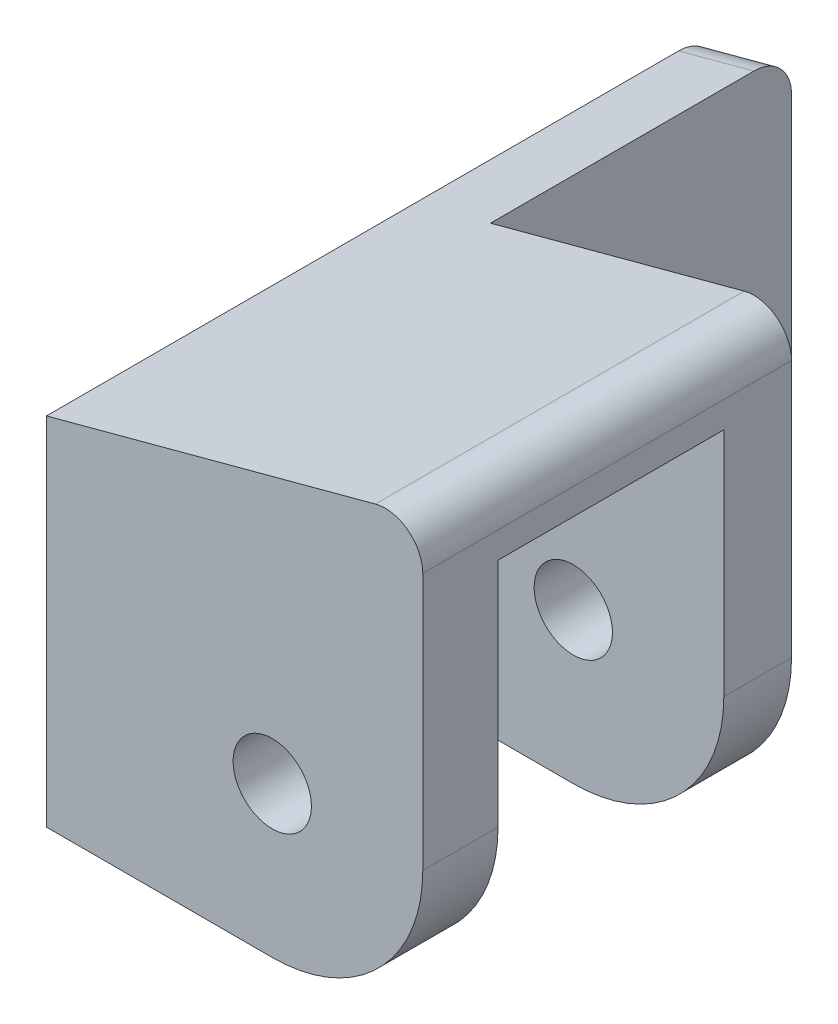
ISO-10303-21;
HEADER;
FILE_DESCRIPTION(('STEP AP214'),'2;1');
FILE_NAME('part.step','',(''),(''),'','','');
FILE_SCHEMA(('AUTOMOTIVE_DESIGN { 1 0 10303 214 1 1 1 1 }'));
ENDSEC;
DATA;
#1=APPLICATION_CONTEXT('core data for automotive mechanical design processes');
#2=APPLICATION_PROTOCOL_DEFINITION('international standard','automotive_design',2000,#1);
#3=PRODUCT_CONTEXT('',#1,'mechanical');
#4=PRODUCT('Part','Part','',(#3));
#5=PRODUCT_RELATED_PRODUCT_CATEGORY('part','',(#4));
#6=PRODUCT_DEFINITION_FORMATION('','',#4);
#7=PRODUCT_DEFINITION_CONTEXT('part definition',#1,'design');
#8=PRODUCT_DEFINITION('design','',#6,#7);
#9=PRODUCT_DEFINITION_SHAPE('','',#8);
#10=(LENGTH_UNIT() NAMED_UNIT(*) SI_UNIT(.MILLI.,.METRE.));
#11=(NAMED_UNIT(*) PLANE_ANGLE_UNIT() SI_UNIT($,.RADIAN.));
#12=(NAMED_UNIT(*) SI_UNIT($,.STERADIAN.) SOLID_ANGLE_UNIT());
#13=UNCERTAINTY_MEASURE_WITH_UNIT(LENGTH_MEASURE(1.E-05),#10,'distance_accuracy_value','');
#14=(GEOMETRIC_REPRESENTATION_CONTEXT(3) GLOBAL_UNCERTAINTY_ASSIGNED_CONTEXT((#13)) GLOBAL_UNIT_ASSIGNED_CONTEXT((#10,
#11,#12)) REPRESENTATION_CONTEXT('',''));
#15=CARTESIAN_POINT('',(0.,0.,0.));
#16=DIRECTION('',(0.,0.,1.));
#17=DIRECTION('',(1.,0.,0.));
#18=AXIS2_PLACEMENT_3D('',#15,#16,#17);
#19=CARTESIAN_POINT('',(10.,-10.,4.5));
#20=DIRECTION('',(-1.,0.,0.));
#21=DIRECTION('',(0.,1.,0.));
#22=AXIS2_PLACEMENT_3D('',#19,#20,#21);
#23=PLANE('',#22);
#24=DIRECTION('',(0.,-1.,0.));
#25=VECTOR('',#24,1.);
#26=CARTESIAN_POINT('',(10.,-10.,0.));
#27=LINE('',#26,#25);
#28=CARTESIAN_POINT('',(10.,17.1009204165195,0.));
#29=VERTEX_POINT('',#28);
#30=CARTESIAN_POINT('',(10.,0.,0.));
#31=VERTEX_POINT('',#30);
#32=EDGE_CURVE('E239',#29,#31,#27,.T.);
#33=ORIENTED_EDGE('',*,*,#32,.F.);
#34=DIRECTION('',(0.,0.,-1.));
#35=VECTOR('',#34,1.);
#36=CARTESIAN_POINT('',(10.,17.1009204165195,0.));
#37=LINE('',#36,#35);
#38=CARTESIAN_POINT('',(10.,17.1009204165195,24.5));
#39=VERTEX_POINT('',#38);
#40=EDGE_CURVE('E256',#39,#29,#37,.T.);
#41=ORIENTED_EDGE('',*,*,#40,.F.);
#42=DIRECTION('',(0.,-1.,0.));
#43=VECTOR('',#42,1.);
#44=CARTESIAN_POINT('',(10.,20.3589838486225,24.5));
#45=LINE('',#44,#43);
#46=CARTESIAN_POINT('',(10.,0.,24.5));
#47=VERTEX_POINT('',#46);
#48=EDGE_CURVE('E160',#39,#47,#45,.T.);
#49=ORIENTED_EDGE('',*,*,#48,.T.);
#50=DIRECTION('',(0.,0.,-1.));
#51=VECTOR('',#50,1.);
#52=CARTESIAN_POINT('',(10.,0.,4.5));
#53=LINE('',#52,#51);
#54=CARTESIAN_POINT('',(10.,0.,19.5));
#55=VERTEX_POINT('',#54);
#56=EDGE_CURVE('E322',#55,#47,#53,.F.);
#57=ORIENTED_EDGE('',*,*,#56,.F.);
#58=DIRECTION('',(0.,-1.,0.));
#59=VECTOR('',#58,1.);
#60=CARTESIAN_POINT('',(10.,20.3589838486225,19.5));
#61=LINE('',#60,#59);
#62=CARTESIAN_POINT('',(10.,15.3589838486225,19.5));
#63=VERTEX_POINT('',#62);
#64=EDGE_CURVE('E185',#63,#55,#61,.T.);
#65=ORIENTED_EDGE('',*,*,#64,.F.);
#66=DIRECTION('',(0.,0.,-1.));
#67=VECTOR('',#66,1.);
#68=CARTESIAN_POINT('',(10.,15.3589838486225,73.8276988943025));
#69=LINE('',#68,#67);
#70=CARTESIAN_POINT('',(10.,15.3589838486225,4.5));
#71=VERTEX_POINT('',#70);
#72=EDGE_CURVE('E174',#63,#71,#69,.T.);
#73=ORIENTED_EDGE('',*,*,#72,.T.);
#74=DIRECTION('',(0.,-1.,0.));
#75=VECTOR('',#74,1.);
#76=CARTESIAN_POINT('',(10.,-10.,4.5));
#77=LINE('',#76,#75);
#78=CARTESIAN_POINT('',(10.,0.,4.5));
#79=VERTEX_POINT('',#78);
#80=EDGE_CURVE('E240',#71,#79,#77,.T.);
#81=ORIENTED_EDGE('',*,*,#80,.T.);
#82=DIRECTION('',(0.,0.,-1.));
#83=VECTOR('',#82,1.);
#84=CARTESIAN_POINT('',(10.,0.,4.5));
#85=LINE('',#84,#83);
#86=EDGE_CURVE('E325',#31,#79,#85,.F.);
#87=ORIENTED_EDGE('',*,*,#86,.F.);
#88=EDGE_LOOP('',(#33,#41,#49,#57,#65,#73,#81,#87));
#89=FACE_BOUND('',#88,.T.);
#90=ADVANCED_FACE('F41',(#89),#23,.F.);
#91=CARTESIAN_POINT('',(10.,-10.,4.5));
#92=DIRECTION('',(0.,1.,0.));
#93=DIRECTION('',(1.,0.,0.));
#94=AXIS2_PLACEMENT_3D('',#91,#92,#93);
#95=PLANE('',#94);
#96=DIRECTION('',(-1.,0.,0.));
#97=VECTOR('',#96,1.);
#98=CARTESIAN_POINT('',(10.,-10.,4.5));
#99=LINE('',#98,#97);
#100=CARTESIAN_POINT('',(0.,-10.,4.5));
#101=VERTEX_POINT('',#100);
#102=CARTESIAN_POINT('',(-10.,-10.,4.5));
#103=VERTEX_POINT('',#102);
#104=EDGE_CURVE('E244',#101,#103,#99,.T.);
#105=ORIENTED_EDGE('',*,*,#104,.T.);
#106=DIRECTION('',(0.,0.,-1.));
#107=VECTOR('',#106,1.);
#108=CARTESIAN_POINT('',(-10.,-10.,73.8276988943025));
#109=LINE('',#108,#107);
#110=CARTESIAN_POINT('',(-10.,-10.,19.5));
#111=VERTEX_POINT('',#110);
#112=EDGE_CURVE('E225',#111,#103,#109,.T.);
#113=ORIENTED_EDGE('',*,*,#112,.F.);
#114=DIRECTION('',(-1.,0.,0.));
#115=VECTOR('',#114,1.);
#116=CARTESIAN_POINT('',(-15.,-10.,19.5));
#117=LINE('',#116,#115);
#118=CARTESIAN_POINT('',(0.,-10.,19.5));
#119=VERTEX_POINT('',#118);
#120=EDGE_CURVE('E181',#119,#111,#117,.T.);
#121=ORIENTED_EDGE('',*,*,#120,.F.);
#122=DIRECTION('',(0.,0.,-1.));
#123=VECTOR('',#122,1.);
#124=CARTESIAN_POINT('',(0.,-10.,4.5));
#125=LINE('',#124,#123);
#126=CARTESIAN_POINT('',(0.,-10.,24.5));
#127=VERTEX_POINT('',#126);
#128=EDGE_CURVE('E312',#127,#119,#125,.T.);
#129=ORIENTED_EDGE('',*,*,#128,.F.);
#130=DIRECTION('',(-1.,0.,0.));
#131=VECTOR('',#130,1.);
#132=CARTESIAN_POINT('',(-15.,-10.,24.5));
#133=LINE('',#132,#131);
#134=CARTESIAN_POINT('',(-15.,-10.,24.5));
#135=VERTEX_POINT('',#134);
#136=EDGE_CURVE('E194',#127,#135,#133,.T.);
#137=ORIENTED_EDGE('',*,*,#136,.T.);
#138=DIRECTION('',(0.,0.,-1.));
#139=VECTOR('',#138,1.);
#140=CARTESIAN_POINT('',(-15.,-10.,73.8276988943025));
#141=LINE('',#140,#139);
#142=CARTESIAN_POINT('',(-15.,-10.,-17.5));
#143=VERTEX_POINT('',#142);
#144=EDGE_CURVE('E173',#135,#143,#141,.T.);
#145=ORIENTED_EDGE('',*,*,#144,.T.);
#146=DIRECTION('',(1.,0.,0.));
#147=VECTOR('',#146,1.);
#148=CARTESIAN_POINT('',(10.,-10.,-17.5));
#149=LINE('',#148,#147);
#150=CARTESIAN_POINT('',(-10.,-10.,-17.5));
#151=VERTEX_POINT('',#150);
#152=EDGE_CURVE('E308',#151,#143,#149,.F.);
#153=ORIENTED_EDGE('',*,*,#152,.F.);
#154=DIRECTION('',(0.,0.,1.));
#155=VECTOR('',#154,1.);
#156=CARTESIAN_POINT('',(-10.,-10.,-20.));
#157=LINE('',#156,#155);
#158=CARTESIAN_POINT('',(-10.,-10.,0.));
#159=VERTEX_POINT('',#158);
#160=EDGE_CURVE('E213',#151,#159,#157,.T.);
#161=ORIENTED_EDGE('',*,*,#160,.T.);
#162=DIRECTION('',(-1.,0.,0.));
#163=VECTOR('',#162,1.);
#164=CARTESIAN_POINT('',(10.,-10.,0.));
#165=LINE('',#164,#163);
#166=CARTESIAN_POINT('',(0.,-10.,0.));
#167=VERTEX_POINT('',#166);
#168=EDGE_CURVE('E245',#167,#159,#165,.T.);
#169=ORIENTED_EDGE('',*,*,#168,.F.);
#170=DIRECTION('',(0.,0.,-1.));
#171=VECTOR('',#170,1.);
#172=CARTESIAN_POINT('',(0.,-10.,4.5));
#173=LINE('',#172,#171);
#174=EDGE_CURVE('E315',#101,#167,#173,.T.);
#175=ORIENTED_EDGE('',*,*,#174,.F.);
#176=EDGE_LOOP('',(#105,#113,#121,#129,#137,#145,#153,#161,#169,#175));
#177=FACE_BOUND('',#176,.T.);
#178=ADVANCED_FACE('F336',(#177),#95,.F.);
#179=CARTESIAN_POINT('',(0.,0.,4.5));
#180=DIRECTION('',(0.,0.,-1.));
#181=DIRECTION('',(-1.,0.,0.));
#182=AXIS2_PLACEMENT_3D('',#179,#180,#181);
#183=PLANE('',#182);
#184=CARTESIAN_POINT('',(0.,0.,4.5));
#185=DIRECTION('',(0.,0.,1.));
#186=DIRECTION('',(-1.,0.,0.));
#187=AXIS2_PLACEMENT_3D('',#184,#185,#186);
#188=CIRCLE('',#187,2.6);
#189=CARTESIAN_POINT('',(-2.6,0.,4.5));
#190=VERTEX_POINT('',#189);
#191=EDGE_CURVE('E188',#190,#190,#188,.T.);
#192=ORIENTED_EDGE('',*,*,#191,.F.);
#193=EDGE_LOOP('',(#192));
#194=FACE_BOUND('',#193,.T.);
#195=ORIENTED_EDGE('',*,*,#80,.F.);
#196=DIRECTION('',(0.965925826289067,0.258819045102525,0.));
#197=VECTOR('',#196,1.);
#198=CARTESIAN_POINT('',(10.,15.3589838486225,4.5));
#199=LINE('',#198,#197);
#200=CARTESIAN_POINT('',(-10.,10.,4.5));
#201=VERTEX_POINT('',#200);
#202=EDGE_CURVE('E253',#201,#71,#199,.T.);
#203=ORIENTED_EDGE('',*,*,#202,.F.);
#204=DIRECTION('',(0.,1.,0.));
#205=VECTOR('',#204,1.);
#206=CARTESIAN_POINT('',(-10.,-10.,4.5));
#207=LINE('',#206,#205);
#208=EDGE_CURVE('E249',#103,#201,#207,.T.);
#209=ORIENTED_EDGE('',*,*,#208,.F.);
#210=ORIENTED_EDGE('',*,*,#104,.F.);
#211=CARTESIAN_POINT('',(0.,0.,4.5));
#212=DIRECTION('',(0.,0.,1.));
#213=DIRECTION('',(-1.,0.,0.));
#214=AXIS2_PLACEMENT_3D('',#211,#212,#213);
#215=CIRCLE('',#214,10.);
#216=EDGE_CURVE('E64',#79,#101,#215,.F.);
#217=ORIENTED_EDGE('',*,*,#216,.F.);
#218=EDGE_LOOP('',(#195,#203,#209,#210,#217));
#219=FACE_BOUND('',#218,.T.);
#220=ADVANCED_FACE('F338',(#194,#219),#183,.F.);
#221=CARTESIAN_POINT('',(0.,0.,0.));
#222=DIRECTION('',(0.,0.,-1.));
#223=DIRECTION('',(-1.,0.,0.));
#224=AXIS2_PLACEMENT_3D('',#221,#222,#223);
#225=PLANE('',#224);
#226=CARTESIAN_POINT('',(0.,0.,0.));
#227=DIRECTION('',(0.,0.,1.));
#228=DIRECTION('',(-1.,0.,0.));
#229=AXIS2_PLACEMENT_3D('',#226,#227,#228);
#230=CIRCLE('',#229,2.6);
#231=CARTESIAN_POINT('',(-2.6,0.,0.));
#232=VERTEX_POINT('',#231);
#233=EDGE_CURVE('E272',#232,#232,#230,.T.);
#234=ORIENTED_EDGE('',*,*,#233,.T.);
#235=EDGE_LOOP('',(#234));
#236=FACE_BOUND('',#235,.T.);
#237=ORIENTED_EDGE('',*,*,#168,.T.);
#238=DIRECTION('',(0.,1.,0.));
#239=VECTOR('',#238,1.);
#240=CARTESIAN_POINT('',(-10.,-10.,0.));
#241=LINE('',#240,#239);
#242=CARTESIAN_POINT('',(-10.,15.,0.));
#243=VERTEX_POINT('',#242);
#244=EDGE_CURVE('E197',#159,#243,#241,.T.);
#245=ORIENTED_EDGE('',*,*,#244,.T.);
#246=DIRECTION('',(-0.965925826289067,-0.258819045102525,0.));
#247=VECTOR('',#246,1.);
#248=CARTESIAN_POINT('',(-15.,13.6602540378444,0.));
#249=LINE('',#248,#247);
#250=CARTESIAN_POINT('',(6.85295238724369,19.5157349822422,0.));
#251=VERTEX_POINT('',#250);
#252=EDGE_CURVE('E217',#251,#243,#249,.T.);
#253=ORIENTED_EDGE('',*,*,#252,.F.);
#254=CARTESIAN_POINT('',(7.50000000000001,17.1009204165195,0.));
#255=DIRECTION('',(0.,0.,1.));
#256=DIRECTION('',(-1.,0.,0.));
#257=AXIS2_PLACEMENT_3D('',#254,#255,#256);
#258=CIRCLE('',#257,2.5);
#259=EDGE_CURVE('E277',#29,#251,#258,.T.);
#260=ORIENTED_EDGE('',*,*,#259,.F.);
#261=ORIENTED_EDGE('',*,*,#32,.T.);
#262=CARTESIAN_POINT('',(0.,0.,0.));
#263=DIRECTION('',(0.,0.,1.));
#264=DIRECTION('',(-1.,0.,0.));
#265=AXIS2_PLACEMENT_3D('',#262,#263,#264);
#266=CIRCLE('',#265,10.);
#267=EDGE_CURVE('E319',#167,#31,#266,.T.);
#268=ORIENTED_EDGE('',*,*,#267,.F.);
#269=EDGE_LOOP('',(#237,#245,#253,#260,#261,#268));
#270=FACE_BOUND('',#269,.T.);
#271=ADVANCED_FACE('F359',(#236,#270),#225,.T.);
#272=CARTESIAN_POINT('',(-10.,10.,73.8276988943025));
#273=DIRECTION('',(0.258819045102525,-0.965925826289067,0.));
#274=DIRECTION('',(-0.965925826289067,-0.258819045102525,0.));
#275=AXIS2_PLACEMENT_3D('',#272,#273,#274);
#276=PLANE('',#275);
#277=ORIENTED_EDGE('',*,*,#202,.T.);
#278=ORIENTED_EDGE('',*,*,#72,.F.);
#279=DIRECTION('',(-0.965925826289067,-0.258819045102525,0.));
#280=VECTOR('',#279,1.);
#281=CARTESIAN_POINT('',(-10.,10.,19.5));
#282=LINE('',#281,#280);
#283=CARTESIAN_POINT('',(-10.,10.,19.5));
#284=VERTEX_POINT('',#283);
#285=EDGE_CURVE('E218',#63,#284,#282,.T.);
#286=ORIENTED_EDGE('',*,*,#285,.T.);
#287=DIRECTION('',(0.,0.,-1.));
#288=VECTOR('',#287,1.);
#289=CARTESIAN_POINT('',(-10.,10.,73.8276988943025));
#290=LINE('',#289,#288);
#291=EDGE_CURVE('E231',#284,#201,#290,.T.);
#292=ORIENTED_EDGE('',*,*,#291,.T.);
#293=EDGE_LOOP('',(#277,#278,#286,#292));
#294=FACE_BOUND('',#293,.T.);
#295=ADVANCED_FACE('F365',(#294),#276,.T.);
#296=CARTESIAN_POINT('',(-10.,10.,73.8276988943025));
#297=DIRECTION('',(1.,0.,0.));
#298=DIRECTION('',(0.,-1.,0.));
#299=AXIS2_PLACEMENT_3D('',#296,#297,#298);
#300=PLANE('',#299);
#301=ORIENTED_EDGE('',*,*,#208,.T.);
#302=ORIENTED_EDGE('',*,*,#291,.F.);
#303=DIRECTION('',(0.,-1.,0.));
#304=VECTOR('',#303,1.);
#305=CARTESIAN_POINT('',(-10.,10.,19.5));
#306=LINE('',#305,#304);
#307=EDGE_CURVE('E222',#284,#111,#306,.T.);
#308=ORIENTED_EDGE('',*,*,#307,.T.);
#309=ORIENTED_EDGE('',*,*,#112,.T.);
#310=EDGE_LOOP('',(#301,#302,#308,#309));
#311=FACE_BOUND('',#310,.T.);
#312=ADVANCED_FACE('F342',(#311),#300,.T.);
#313=CARTESIAN_POINT('',(-15.,-10.,73.8276988943025));
#314=DIRECTION('',(-1.,0.,0.));
#315=DIRECTION('',(0.,1.,0.));
#316=AXIS2_PLACEMENT_3D('',#313,#314,#315);
#317=PLANE('',#316);
#318=CARTESIAN_POINT('',(-15.,1.83012701892218,-10.));
#319=DIRECTION('',(1.,0.,0.));
#320=DIRECTION('',(0.,1.,0.));
#321=AXIS2_PLACEMENT_3D('',#318,#319,#320);
#322=CIRCLE('',#321,2.6);
#323=CARTESIAN_POINT('',(-15.,4.43012701892218,-10.));
#324=VERTEX_POINT('',#323);
#325=EDGE_CURVE('E273',#324,#324,#322,.T.);
#326=ORIENTED_EDGE('',*,*,#325,.T.);
#327=EDGE_LOOP('',(#326));
#328=FACE_BOUND('',#327,.T.);
#329=DIRECTION('',(0.,-1.,0.));
#330=VECTOR('',#329,1.);
#331=CARTESIAN_POINT('',(-15.,-10.,-20.));
#332=LINE('',#331,#330);
#333=CARTESIAN_POINT('',(-15.,11.0720635868192,-20.));
#334=VERTEX_POINT('',#333);
#335=CARTESIAN_POINT('',(-15.,-7.5,-20.));
#336=VERTEX_POINT('',#335);
#337=EDGE_CURVE('E200',#334,#336,#332,.T.);
#338=ORIENTED_EDGE('',*,*,#337,.T.);
#339=CARTESIAN_POINT('',(-15.,-7.5,-17.5));
#340=DIRECTION('',(1.,0.,0.));
#341=DIRECTION('',(0.,1.,0.));
#342=AXIS2_PLACEMENT_3D('',#339,#340,#341);
#343=CIRCLE('',#342,2.5);
#344=EDGE_CURVE('E294',#143,#336,#343,.T.);
#345=ORIENTED_EDGE('',*,*,#344,.F.);
#346=ORIENTED_EDGE('',*,*,#144,.F.);
#347=DIRECTION('',(0.,1.,0.));
#348=VECTOR('',#347,1.);
#349=CARTESIAN_POINT('',(-15.,13.6602540378444,24.5));
#350=LINE('',#349,#348);
#351=CARTESIAN_POINT('',(-15.,13.6602540378444,24.5));
#352=VERTEX_POINT('',#351);
#353=EDGE_CURVE('E154',#135,#352,#350,.T.);
#354=ORIENTED_EDGE('',*,*,#353,.T.);
#355=DIRECTION('',(0.,0.,-1.));
#356=VECTOR('',#355,1.);
#357=CARTESIAN_POINT('',(-15.,13.6602540378444,73.8276988943025));
#358=LINE('',#357,#356);
#359=CARTESIAN_POINT('',(-15.,13.6602540378444,-17.5));
#360=VERTEX_POINT('',#359);
#361=EDGE_CURVE('E163',#352,#360,#358,.T.);
#362=ORIENTED_EDGE('',*,*,#361,.T.);
#363=CARTESIAN_POINT('',(-15.,11.0720635868192,-17.5));
#364=DIRECTION('',(1.,0.,0.));
#365=DIRECTION('',(0.,1.,0.));
#366=AXIS2_PLACEMENT_3D('',#363,#364,#365);
#367=ELLIPSE('',#366,2.58819045102521,2.5);
#368=EDGE_CURVE('E298',#334,#360,#367,.T.);
#369=ORIENTED_EDGE('',*,*,#368,.F.);
#370=EDGE_LOOP('',(#338,#345,#346,#354,#362,#369));
#371=FACE_BOUND('',#370,.T.);
#372=ADVANCED_FACE('F177',(#328,#371),#317,.T.);
#373=CARTESIAN_POINT('',(-15.,13.6602540378444,73.8276988943025));
#374=DIRECTION('',(-0.258819045102525,0.965925826289067,0.));
#375=DIRECTION('',(0.965925826289067,0.258819045102525,0.));
#376=AXIS2_PLACEMENT_3D('',#373,#374,#375);
#377=PLANE('',#376);
#378=ORIENTED_EDGE('',*,*,#252,.T.);
#379=DIRECTION('',(0.,0.,1.));
#380=VECTOR('',#379,1.);
#381=CARTESIAN_POINT('',(-10.,15.,-20.));
#382=LINE('',#381,#380);
#383=CARTESIAN_POINT('',(-10.,15.,-17.5));
#384=VERTEX_POINT('',#383);
#385=EDGE_CURVE('E207',#384,#243,#382,.T.);
#386=ORIENTED_EDGE('',*,*,#385,.F.);
#387=DIRECTION('',(-0.965925826289067,-0.258819045102525,0.));
#388=VECTOR('',#387,1.);
#389=CARTESIAN_POINT('',(-10.,15.,-17.5));
#390=LINE('',#389,#388);
#391=EDGE_CURVE('E168',#360,#384,#390,.F.);
#392=ORIENTED_EDGE('',*,*,#391,.F.);
#393=ORIENTED_EDGE('',*,*,#361,.F.);
#394=DIRECTION('',(0.965925826289067,0.258819045102525,0.));
#395=VECTOR('',#394,1.);
#396=CARTESIAN_POINT('',(-15.,13.6602540378444,24.5));
#397=LINE('',#396,#395);
#398=CARTESIAN_POINT('',(6.85295238724369,19.5157349822422,24.5));
#399=VERTEX_POINT('',#398);
#400=EDGE_CURVE('E148',#352,#399,#397,.T.);
#401=ORIENTED_EDGE('',*,*,#400,.T.);
#402=DIRECTION('',(0.,0.,-1.));
#403=VECTOR('',#402,1.);
#404=CARTESIAN_POINT('',(6.85295238724369,19.5157349822422,24.5));
#405=LINE('',#404,#403);
#406=EDGE_CURVE('E283',#251,#399,#405,.F.);
#407=ORIENTED_EDGE('',*,*,#406,.F.);
#408=EDGE_LOOP('',(#378,#386,#392,#393,#401,#407));
#409=FACE_BOUND('',#408,.T.);
#410=ADVANCED_FACE('F165',(#409),#377,.T.);
#411=CARTESIAN_POINT('',(-10.,-10.,-20.));
#412=DIRECTION('',(-1.,0.,0.));
#413=DIRECTION('',(0.,1.,0.));
#414=AXIS2_PLACEMENT_3D('',#411,#412,#413);
#415=PLANE('',#414);
#416=CARTESIAN_POINT('',(-10.,1.83012701892218,-10.));
#417=DIRECTION('',(1.,0.,0.));
#418=DIRECTION('',(0.,1.,0.));
#419=AXIS2_PLACEMENT_3D('',#416,#417,#418);
#420=CIRCLE('',#419,2.6);
#421=CARTESIAN_POINT('',(-10.,4.43012701892218,-10.));
#422=VERTEX_POINT('',#421);
#423=EDGE_CURVE('E268',#422,#422,#420,.T.);
#424=ORIENTED_EDGE('',*,*,#423,.F.);
#425=EDGE_LOOP('',(#424));
#426=FACE_BOUND('',#425,.T.);
#427=ORIENTED_EDGE('',*,*,#385,.T.);
#428=ORIENTED_EDGE('',*,*,#244,.F.);
#429=ORIENTED_EDGE('',*,*,#160,.F.);
#430=CARTESIAN_POINT('',(-10.,-7.5,-17.5));
#431=DIRECTION('',(1.,0.,0.));
#432=DIRECTION('',(0.,1.,0.));
#433=AXIS2_PLACEMENT_3D('',#430,#431,#432);
#434=CIRCLE('',#433,2.5);
#435=CARTESIAN_POINT('',(-10.,-7.5,-20.));
#436=VERTEX_POINT('',#435);
#437=EDGE_CURVE('E301',#436,#151,#434,.F.);
#438=ORIENTED_EDGE('',*,*,#437,.F.);
#439=DIRECTION('',(0.,1.,0.));
#440=VECTOR('',#439,1.);
#441=CARTESIAN_POINT('',(-10.,-10.,-20.));
#442=LINE('',#441,#440);
#443=CARTESIAN_POINT('',(-10.,12.4118095489748,-20.));
#444=VERTEX_POINT('',#443);
#445=EDGE_CURVE('E203',#436,#444,#442,.T.);
#446=ORIENTED_EDGE('',*,*,#445,.T.);
#447=CARTESIAN_POINT('',(-10.,12.4118095489748,-17.5));
#448=DIRECTION('',(1.,0.,0.));
#449=DIRECTION('',(0.,1.,0.));
#450=AXIS2_PLACEMENT_3D('',#447,#448,#449);
#451=ELLIPSE('',#450,2.58819045102521,2.5);
#452=EDGE_CURVE('E304',#384,#444,#451,.F.);
#453=ORIENTED_EDGE('',*,*,#452,.F.);
#454=EDGE_LOOP('',(#427,#428,#429,#438,#446,#453));
#455=FACE_BOUND('',#454,.T.);
#456=ADVANCED_FACE('F356',(#426,#455),#415,.F.);
#457=CARTESIAN_POINT('',(0.,0.,-20.));
#458=DIRECTION('',(0.,0.,1.));
#459=DIRECTION('',(1.,0.,0.));
#460=AXIS2_PLACEMENT_3D('',#457,#458,#459);
#461=PLANE('',#460);
#462=ORIENTED_EDGE('',*,*,#445,.F.);
#463=DIRECTION('',(1.,0.,0.));
#464=VECTOR('',#463,1.);
#465=CARTESIAN_POINT('',(0.,-7.5,-20.));
#466=LINE('',#465,#464);
#467=EDGE_CURVE('E288',#336,#436,#466,.T.);
#468=ORIENTED_EDGE('',*,*,#467,.F.);
#469=ORIENTED_EDGE('',*,*,#337,.F.);
#470=DIRECTION('',(-0.965925826289067,-0.258819045102525,0.));
#471=VECTOR('',#470,1.);
#472=CARTESIAN_POINT('',(-14.3529523872437,11.2454394721217,-20.));
#473=LINE('',#472,#471);
#474=EDGE_CURVE('E291',#444,#334,#473,.T.);
#475=ORIENTED_EDGE('',*,*,#474,.F.);
#476=EDGE_LOOP('',(#462,#468,#469,#475));
#477=FACE_BOUND('',#476,.T.);
#478=ADVANCED_FACE('F467',(#477),#461,.F.);
#479=CARTESIAN_POINT('',(0.,0.,24.5));
#480=DIRECTION('',(0.,0.,-1.));
#481=DIRECTION('',(-1.,0.,0.));
#482=AXIS2_PLACEMENT_3D('',#479,#480,#481);
#483=PLANE('',#482);
#484=CARTESIAN_POINT('',(0.,0.,24.5));
#485=DIRECTION('',(0.,0.,1.));
#486=DIRECTION('',(-1.,0.,0.));
#487=AXIS2_PLACEMENT_3D('',#484,#485,#486);
#488=CIRCLE('',#487,2.6);
#489=CARTESIAN_POINT('',(-2.6,0.,24.5));
#490=VERTEX_POINT('',#489);
#491=EDGE_CURVE('E267',#490,#490,#488,.T.);
#492=ORIENTED_EDGE('',*,*,#491,.F.);
#493=EDGE_LOOP('',(#492));
#494=FACE_BOUND('',#493,.T.);
#495=ORIENTED_EDGE('',*,*,#48,.F.);
#496=CARTESIAN_POINT('',(7.50000000000001,17.1009204165195,24.5));
#497=DIRECTION('',(0.,0.,1.));
#498=DIRECTION('',(-1.,0.,0.));
#499=AXIS2_PLACEMENT_3D('',#496,#497,#498);
#500=CIRCLE('',#499,2.5);
#501=EDGE_CURVE('E156',#399,#39,#500,.F.);
#502=ORIENTED_EDGE('',*,*,#501,.F.);
#503=ORIENTED_EDGE('',*,*,#400,.F.);
#504=ORIENTED_EDGE('',*,*,#353,.F.);
#505=ORIENTED_EDGE('',*,*,#136,.F.);
#506=CARTESIAN_POINT('',(0.,0.,24.5));
#507=DIRECTION('',(0.,0.,1.));
#508=DIRECTION('',(-1.,0.,0.));
#509=AXIS2_PLACEMENT_3D('',#506,#507,#508);
#510=CIRCLE('',#509,10.);
#511=EDGE_CURVE('E12',#47,#127,#510,.F.);
#512=ORIENTED_EDGE('',*,*,#511,.F.);
#513=EDGE_LOOP('',(#495,#502,#503,#504,#505,#512));
#514=FACE_BOUND('',#513,.T.);
#515=ADVANCED_FACE('F151',(#494,#514),#483,.F.);
#516=CARTESIAN_POINT('',(0.,0.,19.5));
#517=DIRECTION('',(0.,0.,-1.));
#518=DIRECTION('',(-1.,0.,0.));
#519=AXIS2_PLACEMENT_3D('',#516,#517,#518);
#520=PLANE('',#519);
#521=CARTESIAN_POINT('',(0.,0.,19.5));
#522=DIRECTION('',(0.,0.,1.));
#523=DIRECTION('',(-1.,0.,0.));
#524=AXIS2_PLACEMENT_3D('',#521,#522,#523);
#525=CIRCLE('',#524,2.6);
#526=CARTESIAN_POINT('',(-2.6,0.,19.5));
#527=VERTEX_POINT('',#526);
#528=EDGE_CURVE('E263',#527,#527,#525,.T.);
#529=ORIENTED_EDGE('',*,*,#528,.T.);
#530=EDGE_LOOP('',(#529));
#531=FACE_BOUND('',#530,.T.);
#532=ORIENTED_EDGE('',*,*,#120,.T.);
#533=ORIENTED_EDGE('',*,*,#307,.F.);
#534=ORIENTED_EDGE('',*,*,#285,.F.);
#535=ORIENTED_EDGE('',*,*,#64,.T.);
#536=CARTESIAN_POINT('',(0.,0.,19.5));
#537=DIRECTION('',(0.,0.,1.));
#538=DIRECTION('',(-1.,0.,0.));
#539=AXIS2_PLACEMENT_3D('',#536,#537,#538);
#540=CIRCLE('',#539,10.);
#541=EDGE_CURVE('E50',#119,#55,#540,.T.);
#542=ORIENTED_EDGE('',*,*,#541,.F.);
#543=EDGE_LOOP('',(#532,#533,#534,#535,#542));
#544=FACE_BOUND('',#543,.T.);
#545=ADVANCED_FACE('F346',(#531,#544),#520,.T.);
#546=CARTESIAN_POINT('',(0.,0.,24.5));
#547=DIRECTION('',(0.,0.,-1.));
#548=DIRECTION('',(-1.,0.,0.));
#549=AXIS2_PLACEMENT_3D('',#546,#547,#548);
#550=CYLINDRICAL_SURFACE('',#549,2.6);
#551=ORIENTED_EDGE('',*,*,#528,.F.);
#552=EDGE_LOOP('',(#551));
#553=FACE_BOUND('',#552,.T.);
#554=ORIENTED_EDGE('',*,*,#491,.T.);
#555=EDGE_LOOP('',(#554));
#556=FACE_BOUND('',#555,.T.);
#557=ADVANCED_FACE('F440',(#553,#556),#550,.F.);
#558=ORIENTED_EDGE('',*,*,#233,.F.);
#559=EDGE_LOOP('',(#558));
#560=FACE_BOUND('',#559,.T.);
#561=ORIENTED_EDGE('',*,*,#191,.T.);
#562=EDGE_LOOP('',(#561));
#563=FACE_BOUND('',#562,.T.);
#564=ADVANCED_FACE('F430',(#560,#563),#550,.F.);
#565=CARTESIAN_POINT('',(10.,1.83012701892219,-10.));
#566=DIRECTION('',(-1.,0.,0.));
#567=DIRECTION('',(0.,1.,0.));
#568=AXIS2_PLACEMENT_3D('',#565,#566,#567);
#569=CYLINDRICAL_SURFACE('',#568,2.6);
#570=ORIENTED_EDGE('',*,*,#325,.F.);
#571=EDGE_LOOP('',(#570));
#572=FACE_BOUND('',#571,.T.);
#573=ORIENTED_EDGE('',*,*,#423,.T.);
#574=EDGE_LOOP('',(#573));
#575=FACE_BOUND('',#574,.T.);
#576=ADVANCED_FACE('F387',(#572,#575),#569,.F.);
#577=CARTESIAN_POINT('',(7.50000000000001,17.1009204165195,4.5));
#578=DIRECTION('',(0.,0.,1.));
#579=DIRECTION('',(1.,0.,0.));
#580=AXIS2_PLACEMENT_3D('',#577,#578,#579);
#581=CYLINDRICAL_SURFACE('',#580,2.5);
#582=ORIENTED_EDGE('',*,*,#501,.T.);
#583=ORIENTED_EDGE('',*,*,#40,.T.);
#584=ORIENTED_EDGE('',*,*,#259,.T.);
#585=ORIENTED_EDGE('',*,*,#406,.T.);
#586=EDGE_LOOP('',(#582,#583,#584,#585));
#587=FACE_BOUND('',#586,.T.);
#588=ADVANCED_FACE('F383',(#587),#581,.T.);
#589=CARTESIAN_POINT('',(-3.77282536832157,14.0803759626606,-17.5));
#590=DIRECTION('',(0.965925826289067,0.258819045102525,0.));
#591=DIRECTION('',(0.258819045102525,-0.965925826289067,0.));
#592=AXIS2_PLACEMENT_3D('',#589,#590,#591);
#593=CYLINDRICAL_SURFACE('',#592,2.5);
#594=ORIENTED_EDGE('',*,*,#452,.T.);
#595=ORIENTED_EDGE('',*,*,#474,.T.);
#596=ORIENTED_EDGE('',*,*,#368,.T.);
#597=ORIENTED_EDGE('',*,*,#391,.T.);
#598=EDGE_LOOP('',(#594,#595,#596,#597));
#599=FACE_BOUND('',#598,.T.);
#600=ADVANCED_FACE('F386',(#599),#593,.T.);
#601=CARTESIAN_POINT('',(0.,-7.5,-17.5));
#602=DIRECTION('',(1.,0.,0.));
#603=DIRECTION('',(0.,-1.,0.));
#604=AXIS2_PLACEMENT_3D('',#601,#602,#603);
#605=CYLINDRICAL_SURFACE('',#604,2.5);
#606=ORIENTED_EDGE('',*,*,#344,.T.);
#607=ORIENTED_EDGE('',*,*,#467,.T.);
#608=ORIENTED_EDGE('',*,*,#437,.T.);
#609=ORIENTED_EDGE('',*,*,#152,.T.);
#610=EDGE_LOOP('',(#606,#607,#608,#609));
#611=FACE_BOUND('',#610,.T.);
#612=ADVANCED_FACE('F352',(#611),#605,.T.);
#613=CARTESIAN_POINT('',(0.,0.,4.5));
#614=DIRECTION('',(0.,0.,-1.));
#615=DIRECTION('',(-1.,0.,0.));
#616=AXIS2_PLACEMENT_3D('',#613,#614,#615);
#617=CYLINDRICAL_SURFACE('',#616,10.);
#618=ORIENTED_EDGE('',*,*,#216,.T.);
#619=ORIENTED_EDGE('',*,*,#174,.T.);
#620=ORIENTED_EDGE('',*,*,#267,.T.);
#621=ORIENTED_EDGE('',*,*,#86,.T.);
#622=EDGE_LOOP('',(#618,#619,#620,#621));
#623=FACE_BOUND('',#622,.T.);
#624=ADVANCED_FACE('F332',(#623),#617,.T.);
#625=CARTESIAN_POINT('',(0.,0.,4.5));
#626=DIRECTION('',(0.,0.,-1.));
#627=DIRECTION('',(-1.,0.,0.));
#628=AXIS2_PLACEMENT_3D('',#625,#626,#627);
#629=CYLINDRICAL_SURFACE('',#628,10.);
#630=ORIENTED_EDGE('',*,*,#511,.T.);
#631=ORIENTED_EDGE('',*,*,#128,.T.);
#632=ORIENTED_EDGE('',*,*,#541,.T.);
#633=ORIENTED_EDGE('',*,*,#56,.T.);
#634=EDGE_LOOP('',(#630,#631,#632,#633));
#635=FACE_BOUND('',#634,.T.);
#636=ADVANCED_FACE('F43',(#635),#629,.T.);
#637=CLOSED_SHELL('',(#90,#178,#220,#271,#295,#312,#372,#410,#456,#478,#515,#545,#557,#564,#576,
#588,#600,#612,#624,#636));
#638=MANIFOLD_SOLID_BREP('B2',#637);
#639=ADVANCED_BREP_SHAPE_REPRESENTATION('',(#18,#638),#14);
#640=SHAPE_DEFINITION_REPRESENTATION(#9,#639);
ENDSEC;
END-ISO-10303-21;
